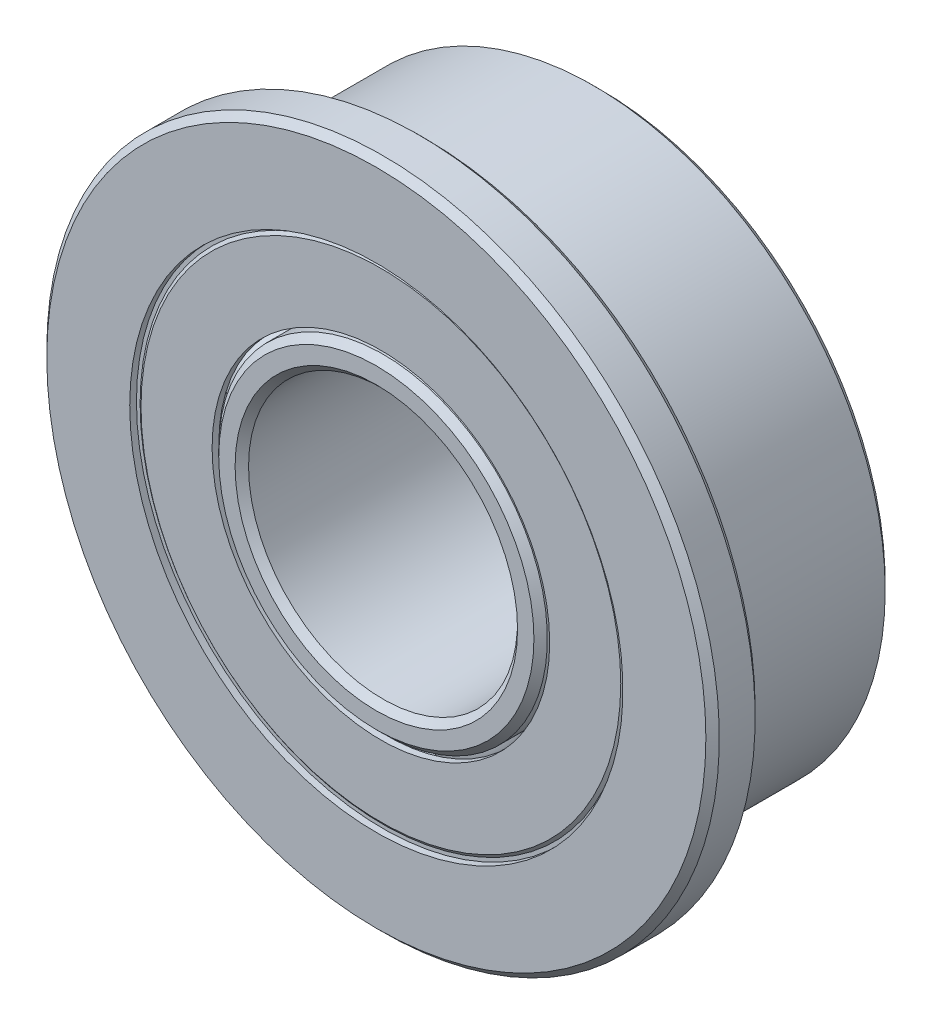
ISO-10303-21;
HEADER;
FILE_DESCRIPTION(('STEP AP214'),'2;1');
FILE_NAME('part.step','',(''),(''),'','','');
FILE_SCHEMA(('AUTOMOTIVE_DESIGN { 1 0 10303 214 1 1 1 1 }'));
ENDSEC;
DATA;
#1=APPLICATION_CONTEXT('core data for automotive mechanical design processes');
#2=APPLICATION_PROTOCOL_DEFINITION('international standard','automotive_design',2000,#1);
#3=PRODUCT_CONTEXT('',#1,'mechanical');
#4=PRODUCT('Part','Part','',(#3));
#5=PRODUCT_RELATED_PRODUCT_CATEGORY('part','',(#4));
#6=PRODUCT_DEFINITION_FORMATION('','',#4);
#7=PRODUCT_DEFINITION_CONTEXT('part definition',#1,'design');
#8=PRODUCT_DEFINITION('design','',#6,#7);
#9=PRODUCT_DEFINITION_SHAPE('','',#8);
#10=(LENGTH_UNIT() NAMED_UNIT(*) SI_UNIT(.MILLI.,.METRE.));
#11=(NAMED_UNIT(*) PLANE_ANGLE_UNIT() SI_UNIT($,.RADIAN.));
#12=(NAMED_UNIT(*) SI_UNIT($,.STERADIAN.) SOLID_ANGLE_UNIT());
#13=UNCERTAINTY_MEASURE_WITH_UNIT(LENGTH_MEASURE(1.E-05),#10,'distance_accuracy_value','');
#14=(GEOMETRIC_REPRESENTATION_CONTEXT(3) GLOBAL_UNCERTAINTY_ASSIGNED_CONTEXT((#13)) GLOBAL_UNIT_ASSIGNED_CONTEXT((#10,
#11,#12)) REPRESENTATION_CONTEXT('',''));
#15=CARTESIAN_POINT('',(0.,0.,0.));
#16=DIRECTION('',(0.,0.,1.));
#17=DIRECTION('',(1.,0.,0.));
#18=AXIS2_PLACEMENT_3D('',#15,#16,#17);
#19=CARTESIAN_POINT('',(0.,4.5825,0.));
#20=DIRECTION('',(0.,0.,1.));
#21=DIRECTION('',(0.,1.,0.));
#22=AXIS2_PLACEMENT_3D('',#19,#20,#21);
#23=SPHERICAL_SURFACE('',#22,1.);
#24=CARTESIAN_POINT('',(0.,4.5825,1.));
#25=VERTEX_POINT('',#24);
#26=VERTEX_LOOP('',#25);
#27=FACE_BOUND('',#26,.T.);
#28=ADVANCED_FACE('P0_F13',(#27),#23,.T.);
#29=CLOSED_SHELL('',(#28));
#30=MANIFOLD_SOLID_BREP('P0_B1',#29);
#31=CARTESIAN_POINT('',(3.24031682478736,3.24031682478735,0.));
#32=DIRECTION('',(0.,0.,1.));
#33=DIRECTION('',(0.707106781186549,0.707106781186546,0.));
#34=AXIS2_PLACEMENT_3D('',#31,#32,#33);
#35=SPHERICAL_SURFACE('',#34,1.);
#36=CARTESIAN_POINT('',(3.24031682478736,3.24031682478735,1.));
#37=VERTEX_POINT('',#36);
#38=VERTEX_LOOP('',#37);
#39=FACE_BOUND('',#38,.T.);
#40=ADVANCED_FACE('P1_F13',(#39),#35,.T.);
#41=CLOSED_SHELL('',(#40));
#42=MANIFOLD_SOLID_BREP('P1_B1',#41);
#43=CARTESIAN_POINT('',(4.5825,0.,0.));
#44=DIRECTION('',(0.,0.,1.));
#45=DIRECTION('',(1.,0.,0.));
#46=AXIS2_PLACEMENT_3D('',#43,#44,#45);
#47=SPHERICAL_SURFACE('',#46,1.);
#48=CARTESIAN_POINT('',(4.5825,0.,1.));
#49=VERTEX_POINT('',#48);
#50=VERTEX_LOOP('',#49);
#51=FACE_BOUND('',#50,.T.);
#52=ADVANCED_FACE('P2_F13',(#51),#47,.T.);
#53=CLOSED_SHELL('',(#52));
#54=MANIFOLD_SOLID_BREP('P2_B1',#53);
#55=CARTESIAN_POINT('',(3.24031682478733,-3.24031682478737,0.));
#56=DIRECTION('',(0.,0.,1.));
#57=DIRECTION('',(0.707106781186544,-0.707106781186551,0.));
#58=AXIS2_PLACEMENT_3D('',#55,#56,#57);
#59=SPHERICAL_SURFACE('',#58,1.);
#60=CARTESIAN_POINT('',(3.24031682478733,-3.24031682478737,1.));
#61=VERTEX_POINT('',#60);
#62=VERTEX_LOOP('',#61);
#63=FACE_BOUND('',#62,.T.);
#64=ADVANCED_FACE('P3_F13',(#63),#59,.T.);
#65=CLOSED_SHELL('',(#64));
#66=MANIFOLD_SOLID_BREP('P3_B1',#65);
#67=CARTESIAN_POINT('',(0.,-4.5825,0.));
#68=DIRECTION('',(0.,0.,1.));
#69=DIRECTION('',(0.,-1.,0.));
#70=AXIS2_PLACEMENT_3D('',#67,#68,#69);
#71=SPHERICAL_SURFACE('',#70,1.);
#72=CARTESIAN_POINT('',(0.,-4.5825,1.));
#73=VERTEX_POINT('',#72);
#74=VERTEX_LOOP('',#73);
#75=FACE_BOUND('',#74,.T.);
#76=ADVANCED_FACE('P4_F13',(#75),#71,.T.);
#77=CLOSED_SHELL('',(#76));
#78=MANIFOLD_SOLID_BREP('P4_B1',#77);
#79=CARTESIAN_POINT('',(0.,5.5,-2.35));
#80=DIRECTION('',(0.,0.,-1.));
#81=DIRECTION('',(-1.,0.,0.));
#82=AXIS2_PLACEMENT_3D('',#79,#80,#81);
#83=PLANE('',#82);
#84=CARTESIAN_POINT('',(0.,0.,-2.35));
#85=DIRECTION('',(0.,0.,-1.));
#86=DIRECTION('',(-1.,0.,0.));
#87=AXIS2_PLACEMENT_3D('',#84,#85,#86);
#88=CIRCLE('',#87,5.5);
#89=CARTESIAN_POINT('',(-5.5,0.,-2.35));
#90=VERTEX_POINT('',#89);
#91=EDGE_CURVE('P5_E43',#90,#90,#88,.T.);
#92=ORIENTED_EDGE('',*,*,#91,.T.);
#93=EDGE_LOOP('',(#92));
#94=FACE_BOUND('',#93,.T.);
#95=CARTESIAN_POINT('',(0.,0.,-2.35));
#96=DIRECTION('',(0.,0.,-1.));
#97=DIRECTION('',(-1.,0.,0.));
#98=AXIS2_PLACEMENT_3D('',#95,#96,#97);
#99=CIRCLE('',#98,5.41874355173163);
#100=CARTESIAN_POINT('',(-5.41874355173163,0.,-2.35));
#101=VERTEX_POINT('',#100);
#102=EDGE_CURVE('P5_E10',#101,#101,#99,.T.);
#103=ORIENTED_EDGE('',*,*,#102,.F.);
#104=EDGE_LOOP('',(#103));
#105=FACE_BOUND('',#104,.T.);
#106=ADVANCED_FACE('P5_F15',(#94,#105),#83,.T.);
#107=CARTESIAN_POINT('',(0.,0.,-2.3981347531258));
#108=DIRECTION('',(0.,0.,1.));
#109=DIRECTION('',(1.,0.,0.));
#110=AXIS2_PLACEMENT_3D('',#107,#108,#109);
#111=CONICAL_SURFACE('',#110,5.35,0.959931088596879);
#112=ORIENTED_EDGE('',*,*,#102,.T.);
#113=EDGE_LOOP('',(#112));
#114=FACE_BOUND('',#113,.T.);
#115=CARTESIAN_POINT('',(0.,0.,-2.3981347531258));
#116=DIRECTION('',(0.,0.,-1.));
#117=DIRECTION('',(-1.,0.,0.));
#118=AXIS2_PLACEMENT_3D('',#115,#116,#117);
#119=CIRCLE('',#118,5.35);
#120=CARTESIAN_POINT('',(-5.35,0.,-2.3981347531258));
#121=VERTEX_POINT('',#120);
#122=EDGE_CURVE('P5_E21',#121,#121,#119,.T.);
#123=ORIENTED_EDGE('',*,*,#122,.F.);
#124=EDGE_LOOP('',(#123));
#125=FACE_BOUND('',#124,.T.);
#126=ADVANCED_FACE('P5_F63',(#114,#125),#111,.T.);
#127=CARTESIAN_POINT('',(0.,5.35,-2.3981347531258));
#128=DIRECTION('',(0.,0.,-1.));
#129=DIRECTION('',(-1.,0.,0.));
#130=AXIS2_PLACEMENT_3D('',#127,#128,#129);
#131=PLANE('',#130);
#132=ORIENTED_EDGE('',*,*,#122,.T.);
#133=EDGE_LOOP('',(#132));
#134=FACE_BOUND('',#133,.T.);
#135=CARTESIAN_POINT('',(0.,0.,-2.3981347531258));
#136=DIRECTION('',(0.,0.,-1.));
#137=DIRECTION('',(-1.,0.,0.));
#138=AXIS2_PLACEMENT_3D('',#135,#136,#137);
#139=CIRCLE('',#138,3.765);
#140=CARTESIAN_POINT('',(-3.765,0.,-2.3981347531258));
#141=VERTEX_POINT('',#140);
#142=EDGE_CURVE('P5_E25',#141,#141,#139,.T.);
#143=ORIENTED_EDGE('',*,*,#142,.F.);
#144=EDGE_LOOP('',(#143));
#145=FACE_BOUND('',#144,.T.);
#146=ADVANCED_FACE('P5_F68',(#134,#145),#131,.T.);
#147=CARTESIAN_POINT('',(0.,0.,0.));
#148=DIRECTION('',(0.,0.,-1.));
#149=DIRECTION('',(-1.,0.,0.));
#150=AXIS2_PLACEMENT_3D('',#147,#148,#149);
#151=CYLINDRICAL_SURFACE('',#150,3.765);
#152=ORIENTED_EDGE('',*,*,#142,.T.);
#153=EDGE_LOOP('',(#152));
#154=FACE_BOUND('',#153,.T.);
#155=CARTESIAN_POINT('',(0.,0.,-2.2481347531258));
#156=DIRECTION('',(0.,0.,-1.));
#157=DIRECTION('',(-1.,0.,0.));
#158=AXIS2_PLACEMENT_3D('',#155,#156,#157);
#159=CIRCLE('',#158,3.765);
#160=CARTESIAN_POINT('',(-3.765,0.,-2.2481347531258));
#161=VERTEX_POINT('',#160);
#162=EDGE_CURVE('P5_E29',#161,#161,#159,.T.);
#163=ORIENTED_EDGE('',*,*,#162,.F.);
#164=EDGE_LOOP('',(#163));
#165=FACE_BOUND('',#164,.T.);
#166=ADVANCED_FACE('P5_F73',(#154,#165),#151,.F.);
#167=CARTESIAN_POINT('',(0.,5.30270518166815,-2.2481347531258));
#168=DIRECTION('',(0.,0.,1.));
#169=DIRECTION('',(1.,0.,0.));
#170=AXIS2_PLACEMENT_3D('',#167,#168,#169);
#171=PLANE('',#170);
#172=ORIENTED_EDGE('',*,*,#162,.T.);
#173=EDGE_LOOP('',(#172));
#174=FACE_BOUND('',#173,.T.);
#175=CARTESIAN_POINT('',(0.,0.,-2.2481347531258));
#176=DIRECTION('',(0.,0.,-1.));
#177=DIRECTION('',(-1.,0.,0.));
#178=AXIS2_PLACEMENT_3D('',#175,#176,#177);
#179=CIRCLE('',#178,5.30270518166815);
#180=CARTESIAN_POINT('',(-5.30270518166815,0.,-2.2481347531258));
#181=VERTEX_POINT('',#180);
#182=EDGE_CURVE('P5_E34',#181,#181,#179,.T.);
#183=ORIENTED_EDGE('',*,*,#182,.F.);
#184=EDGE_LOOP('',(#183));
#185=FACE_BOUND('',#184,.T.);
#186=ADVANCED_FACE('P5_F79',(#174,#185),#171,.T.);
#187=CARTESIAN_POINT('',(0.,0.,-2.21501856481159));
#188=DIRECTION('',(0.,0.,1.));
#189=DIRECTION('',(1.,0.,0.));
#190=AXIS2_PLACEMENT_3D('',#187,#188,#189);
#191=CONICAL_SURFACE('',#190,5.35,0.959931088596885);
#192=ORIENTED_EDGE('',*,*,#182,.T.);
#193=EDGE_LOOP('',(#192));
#194=FACE_BOUND('',#193,.T.);
#195=CARTESIAN_POINT('',(0.,0.,-2.21501856481159));
#196=DIRECTION('',(0.,0.,-1.));
#197=DIRECTION('',(-1.,0.,0.));
#198=AXIS2_PLACEMENT_3D('',#195,#196,#197);
#199=CIRCLE('',#198,5.35);
#200=CARTESIAN_POINT('',(-5.35,0.,-2.21501856481159));
#201=VERTEX_POINT('',#200);
#202=EDGE_CURVE('P5_E37',#201,#201,#199,.T.);
#203=ORIENTED_EDGE('',*,*,#202,.F.);
#204=EDGE_LOOP('',(#203));
#205=FACE_BOUND('',#204,.T.);
#206=ADVANCED_FACE('P5_F59',(#194,#205),#191,.F.);
#207=CARTESIAN_POINT('',(0.,5.35,-2.21501856481158));
#208=DIRECTION('',(0.,0.,1.));
#209=DIRECTION('',(1.,0.,0.));
#210=AXIS2_PLACEMENT_3D('',#207,#208,#209);
#211=PLANE('',#210);
#212=ORIENTED_EDGE('',*,*,#202,.T.);
#213=EDGE_LOOP('',(#212));
#214=FACE_BOUND('',#213,.T.);
#215=CARTESIAN_POINT('',(0.,0.,-2.21501856481158));
#216=DIRECTION('',(0.,0.,-1.));
#217=DIRECTION('',(-1.,0.,0.));
#218=AXIS2_PLACEMENT_3D('',#215,#216,#217);
#219=CIRCLE('',#218,5.5);
#220=CARTESIAN_POINT('',(-5.5,0.,-2.21501856481158));
#221=VERTEX_POINT('',#220);
#222=EDGE_CURVE('P5_E40',#221,#221,#219,.T.);
#223=ORIENTED_EDGE('',*,*,#222,.F.);
#224=EDGE_LOOP('',(#223));
#225=FACE_BOUND('',#224,.T.);
#226=ADVANCED_FACE('P5_F51',(#214,#225),#211,.T.);
#227=CARTESIAN_POINT('',(0.,0.,0.));
#228=DIRECTION('',(0.,0.,-1.));
#229=DIRECTION('',(-1.,0.,0.));
#230=AXIS2_PLACEMENT_3D('',#227,#228,#229);
#231=CYLINDRICAL_SURFACE('',#230,5.5);
#232=ORIENTED_EDGE('',*,*,#222,.T.);
#233=EDGE_LOOP('',(#232));
#234=FACE_BOUND('',#233,.T.);
#235=ORIENTED_EDGE('',*,*,#91,.F.);
#236=EDGE_LOOP('',(#235));
#237=FACE_BOUND('',#236,.T.);
#238=ADVANCED_FACE('P5_F49',(#234,#237),#231,.T.);
#239=CLOSED_SHELL('',(#106,#126,#146,#166,#186,#206,#226,#238));
#240=MANIFOLD_SOLID_BREP('P5_B1',#239);
#241=CARTESIAN_POINT('',(-3.24031682478738,-3.24031682478732,0.));
#242=DIRECTION('',(0.,0.,1.));
#243=DIRECTION('',(-0.707106781186554,-0.707106781186541,0.));
#244=AXIS2_PLACEMENT_3D('',#241,#242,#243);
#245=SPHERICAL_SURFACE('',#244,1.);
#246=CARTESIAN_POINT('',(-3.24031682478738,-3.24031682478732,1.));
#247=VERTEX_POINT('',#246);
#248=VERTEX_LOOP('',#247);
#249=FACE_BOUND('',#248,.T.);
#250=ADVANCED_FACE('P6_F13',(#249),#245,.T.);
#251=CLOSED_SHELL('',(#250));
#252=MANIFOLD_SOLID_BREP('P6_B1',#251);
#253=CARTESIAN_POINT('',(0.,0.,0.));
#254=DIRECTION('',(0.,0.,-1.));
#255=DIRECTION('',(-1.,0.,0.));
#256=AXIS2_PLACEMENT_3D('',#253,#254,#255);
#257=TOROIDAL_SURFACE('',#256,4.5825,0.92698521097883);
#258=CARTESIAN_POINT('',(0.,0.,-0.132269918626519));
#259=DIRECTION('',(0.,0.,-1.));
#260=DIRECTION('',(-1.,0.,0.));
#261=AXIS2_PLACEMENT_3D('',#258,#259,#260);
#262=CIRCLE('',#261,5.5);
#263=CARTESIAN_POINT('',(-5.5,0.,-0.132269918626519));
#264=VERTEX_POINT('',#263);
#265=EDGE_CURVE('P7_E18',#264,#264,#262,.T.);
#266=ORIENTED_EDGE('',*,*,#265,.T.);
#267=EDGE_LOOP('',(#266));
#268=FACE_BOUND('',#267,.T.);
#269=CARTESIAN_POINT('',(0.,0.,0.132269918626519));
#270=DIRECTION('',(0.,0.,-1.));
#271=DIRECTION('',(-1.,0.,0.));
#272=AXIS2_PLACEMENT_3D('',#269,#270,#271);
#273=CIRCLE('',#272,5.5);
#274=CARTESIAN_POINT('',(-5.5,0.,0.132269918626519));
#275=VERTEX_POINT('',#274);
#276=EDGE_CURVE('P7_E31',#275,#275,#273,.T.);
#277=ORIENTED_EDGE('',*,*,#276,.F.);
#278=EDGE_LOOP('',(#277));
#279=FACE_BOUND('',#278,.T.);
#280=ADVANCED_FACE('P7_F15',(#268,#279),#257,.F.);
#281=CARTESIAN_POINT('',(0.,0.,0.));
#282=DIRECTION('',(0.,0.,-1.));
#283=DIRECTION('',(-1.,0.,0.));
#284=AXIS2_PLACEMENT_3D('',#281,#282,#283);
#285=CYLINDRICAL_SURFACE('',#284,5.5);
#286=CARTESIAN_POINT('',(0.,0.,-2.35));
#287=DIRECTION('',(0.,0.,-1.));
#288=DIRECTION('',(-1.,0.,0.));
#289=AXIS2_PLACEMENT_3D('',#286,#287,#288);
#290=CIRCLE('',#289,5.5);
#291=CARTESIAN_POINT('',(-5.5,0.,-2.35));
#292=VERTEX_POINT('',#291);
#293=EDGE_CURVE('P7_E26',#292,#292,#290,.T.);
#294=ORIENTED_EDGE('',*,*,#293,.T.);
#295=EDGE_LOOP('',(#294));
#296=FACE_BOUND('',#295,.T.);
#297=ORIENTED_EDGE('',*,*,#265,.F.);
#298=EDGE_LOOP('',(#297));
#299=FACE_BOUND('',#298,.T.);
#300=ADVANCED_FACE('P7_F45',(#296,#299),#285,.F.);
#301=CARTESIAN_POINT('',(0.,0.,-2.35));
#302=DIRECTION('',(0.,0.,-1.));
#303=DIRECTION('',(-1.,0.,0.));
#304=AXIS2_PLACEMENT_3D('',#301,#302,#303);
#305=CONICAL_SURFACE('',#304,5.5,0.785398163397451);
#306=CARTESIAN_POINT('',(0.,0.,-2.5));
#307=DIRECTION('',(0.,0.,-1.));
#308=DIRECTION('',(-1.,0.,0.));
#309=AXIS2_PLACEMENT_3D('',#306,#307,#308);
#310=CIRCLE('',#309,5.65);
#311=CARTESIAN_POINT('',(-5.65,0.,-2.5));
#312=VERTEX_POINT('',#311);
#313=EDGE_CURVE('P7_E40',#312,#312,#310,.T.);
#314=ORIENTED_EDGE('',*,*,#313,.T.);
#315=EDGE_LOOP('',(#314));
#316=FACE_BOUND('',#315,.T.);
#317=ORIENTED_EDGE('',*,*,#293,.F.);
#318=EDGE_LOOP('',(#317));
#319=FACE_BOUND('',#318,.T.);
#320=ADVANCED_FACE('P7_F48',(#316,#319),#305,.F.);
#321=CARTESIAN_POINT('',(0.,5.65,-2.5));
#322=DIRECTION('',(0.,0.,-1.));
#323=DIRECTION('',(-1.,0.,0.));
#324=AXIS2_PLACEMENT_3D('',#321,#322,#323);
#325=PLANE('',#324);
#326=CARTESIAN_POINT('',(0.,0.,-2.5));
#327=DIRECTION('',(0.,0.,-1.));
#328=DIRECTION('',(-1.,0.,0.));
#329=AXIS2_PLACEMENT_3D('',#326,#327,#328);
#330=CIRCLE('',#329,6.35);
#331=CARTESIAN_POINT('',(-6.35,0.,-2.5));
#332=VERTEX_POINT('',#331);
#333=EDGE_CURVE('P7_E37',#332,#332,#330,.T.);
#334=ORIENTED_EDGE('',*,*,#333,.T.);
#335=EDGE_LOOP('',(#334));
#336=FACE_BOUND('',#335,.T.);
#337=ORIENTED_EDGE('',*,*,#313,.F.);
#338=EDGE_LOOP('',(#337));
#339=FACE_BOUND('',#338,.T.);
#340=ADVANCED_FACE('P7_F50',(#336,#339),#325,.T.);
#341=CARTESIAN_POINT('',(0.,0.,-2.5));
#342=DIRECTION('',(0.,0.,1.));
#343=DIRECTION('',(1.,0.,0.));
#344=AXIS2_PLACEMENT_3D('',#341,#342,#343);
#345=CONICAL_SURFACE('',#344,6.35,0.785398163397446);
#346=CARTESIAN_POINT('',(0.,0.,-2.35));
#347=DIRECTION('',(0.,0.,-1.));
#348=DIRECTION('',(-1.,0.,0.));
#349=AXIS2_PLACEMENT_3D('',#346,#347,#348);
#350=CIRCLE('',#349,6.5);
#351=CARTESIAN_POINT('',(-6.5,0.,-2.35));
#352=VERTEX_POINT('',#351);
#353=EDGE_CURVE('P7_E34',#352,#352,#350,.T.);
#354=ORIENTED_EDGE('',*,*,#353,.T.);
#355=EDGE_LOOP('',(#354));
#356=FACE_BOUND('',#355,.T.);
#357=ORIENTED_EDGE('',*,*,#333,.F.);
#358=EDGE_LOOP('',(#357));
#359=FACE_BOUND('',#358,.T.);
#360=ADVANCED_FACE('P7_F59',(#356,#359),#345,.T.);
#361=CARTESIAN_POINT('',(0.,0.,0.));
#362=DIRECTION('',(0.,0.,-1.));
#363=DIRECTION('',(-1.,0.,0.));
#364=AXIS2_PLACEMENT_3D('',#361,#362,#363);
#365=CYLINDRICAL_SURFACE('',#364,6.5);
#366=CARTESIAN_POINT('',(0.,0.,1.4));
#367=DIRECTION('',(0.,0.,-1.));
#368=DIRECTION('',(-1.,0.,0.));
#369=AXIS2_PLACEMENT_3D('',#366,#367,#368);
#370=CIRCLE('',#369,6.5);
#371=CARTESIAN_POINT('',(-6.5,0.,1.4));
#372=VERTEX_POINT('',#371);
#373=EDGE_CURVE('P7_E10',#372,#372,#370,.F.);
#374=ORIENTED_EDGE('',*,*,#373,.F.);
#375=EDGE_LOOP('',(#374));
#376=FACE_BOUND('',#375,.T.);
#377=ORIENTED_EDGE('',*,*,#353,.F.);
#378=EDGE_LOOP('',(#377));
#379=FACE_BOUND('',#378,.T.);
#380=ADVANCED_FACE('P7_F75',(#376,#379),#365,.T.);
#381=CARTESIAN_POINT('',(0.,0.,0.));
#382=DIRECTION('',(0.,0.,-1.));
#383=DIRECTION('',(-1.,0.,0.));
#384=AXIS2_PLACEMENT_3D('',#381,#382,#383);
#385=CYLINDRICAL_SURFACE('',#384,5.5);
#386=ORIENTED_EDGE('',*,*,#276,.T.);
#387=EDGE_LOOP('',(#386));
#388=FACE_BOUND('',#387,.T.);
#389=CARTESIAN_POINT('',(0.,0.,2.5));
#390=DIRECTION('',(0.,0.,-1.));
#391=DIRECTION('',(-1.,0.,0.));
#392=AXIS2_PLACEMENT_3D('',#389,#390,#391);
#393=CIRCLE('',#392,5.5);
#394=CARTESIAN_POINT('',(-5.5,0.,2.5));
#395=VERTEX_POINT('',#394);
#396=EDGE_CURVE('P7_E29',#395,#395,#393,.T.);
#397=ORIENTED_EDGE('',*,*,#396,.F.);
#398=EDGE_LOOP('',(#397));
#399=FACE_BOUND('',#398,.T.);
#400=ADVANCED_FACE('P7_F71',(#388,#399),#385,.F.);
#401=CARTESIAN_POINT('',(0.,0.,2.35));
#402=DIRECTION('',(0.,0.,-1.));
#403=DIRECTION('',(-1.,0.,0.));
#404=AXIS2_PLACEMENT_3D('',#401,#402,#403);
#405=CONICAL_SURFACE('',#404,7.5,0.785398163397451);
#406=CARTESIAN_POINT('',(0.,0.,2.5));
#407=DIRECTION('',(0.,0.,-1.));
#408=DIRECTION('',(-1.,0.,0.));
#409=AXIS2_PLACEMENT_3D('',#406,#407,#408);
#410=CIRCLE('',#409,7.35);
#411=CARTESIAN_POINT('',(-7.35,0.,2.5));
#412=VERTEX_POINT('',#411);
#413=EDGE_CURVE('P7_E80',#412,#412,#410,.T.);
#414=ORIENTED_EDGE('',*,*,#413,.T.);
#415=EDGE_LOOP('',(#414));
#416=FACE_BOUND('',#415,.T.);
#417=CARTESIAN_POINT('',(0.,0.,2.35));
#418=DIRECTION('',(0.,0.,-1.));
#419=DIRECTION('',(-1.,0.,0.));
#420=AXIS2_PLACEMENT_3D('',#417,#418,#419);
#421=CIRCLE('',#420,7.5);
#422=CARTESIAN_POINT('',(-7.5,0.,2.35));
#423=VERTEX_POINT('',#422);
#424=EDGE_CURVE('P7_E82',#423,#423,#421,.T.);
#425=ORIENTED_EDGE('',*,*,#424,.F.);
#426=EDGE_LOOP('',(#425));
#427=FACE_BOUND('',#426,.T.);
#428=ADVANCED_FACE('P7_F74',(#416,#427),#405,.T.);
#429=CARTESIAN_POINT('',(0.,0.,0.));
#430=DIRECTION('',(0.,0.,-1.));
#431=DIRECTION('',(-1.,0.,0.));
#432=AXIS2_PLACEMENT_3D('',#429,#430,#431);
#433=CYLINDRICAL_SURFACE('',#432,7.5);
#434=ORIENTED_EDGE('',*,*,#424,.T.);
#435=EDGE_LOOP('',(#434));
#436=FACE_BOUND('',#435,.T.);
#437=CARTESIAN_POINT('',(0.,0.,1.55));
#438=DIRECTION('',(0.,0.,-1.));
#439=DIRECTION('',(-1.,0.,0.));
#440=AXIS2_PLACEMENT_3D('',#437,#438,#439);
#441=CIRCLE('',#440,7.5);
#442=CARTESIAN_POINT('',(-7.5,0.,1.55));
#443=VERTEX_POINT('',#442);
#444=EDGE_CURVE('P7_E86',#443,#443,#441,.T.);
#445=ORIENTED_EDGE('',*,*,#444,.F.);
#446=EDGE_LOOP('',(#445));
#447=FACE_BOUND('',#446,.T.);
#448=ADVANCED_FACE('P7_F99',(#436,#447),#433,.T.);
#449=CARTESIAN_POINT('',(0.,0.,1.4));
#450=DIRECTION('',(0.,0.,1.));
#451=DIRECTION('',(1.,0.,0.));
#452=AXIS2_PLACEMENT_3D('',#449,#450,#451);
#453=CONICAL_SURFACE('',#452,7.35,0.785398163397454);
#454=ORIENTED_EDGE('',*,*,#444,.T.);
#455=EDGE_LOOP('',(#454));
#456=FACE_BOUND('',#455,.T.);
#457=CARTESIAN_POINT('',(0.,0.,1.4));
#458=DIRECTION('',(0.,0.,-1.));
#459=DIRECTION('',(-1.,0.,0.));
#460=AXIS2_PLACEMENT_3D('',#457,#458,#459);
#461=CIRCLE('',#460,7.35);
#462=CARTESIAN_POINT('',(-7.35,0.,1.4));
#463=VERTEX_POINT('',#462);
#464=EDGE_CURVE('P7_E91',#463,#463,#461,.T.);
#465=ORIENTED_EDGE('',*,*,#464,.F.);
#466=EDGE_LOOP('',(#465));
#467=FACE_BOUND('',#466,.T.);
#468=ADVANCED_FACE('P7_F97',(#456,#467),#453,.T.);
#469=CARTESIAN_POINT('',(0.,7.35,1.4));
#470=DIRECTION('',(0.,0.,-1.));
#471=DIRECTION('',(-1.,0.,0.));
#472=AXIS2_PLACEMENT_3D('',#469,#470,#471);
#473=PLANE('',#472);
#474=ORIENTED_EDGE('',*,*,#373,.T.);
#475=EDGE_LOOP('',(#474));
#476=FACE_BOUND('',#475,.T.);
#477=ORIENTED_EDGE('',*,*,#464,.T.);
#478=EDGE_LOOP('',(#477));
#479=FACE_BOUND('',#478,.T.);
#480=ADVANCED_FACE('P7_F95',(#476,#479),#473,.T.);
#481=CARTESIAN_POINT('',(0.,6.35,2.5));
#482=DIRECTION('',(0.,0.,1.));
#483=DIRECTION('',(1.,0.,0.));
#484=AXIS2_PLACEMENT_3D('',#481,#482,#483);
#485=PLANE('',#484);
#486=ORIENTED_EDGE('',*,*,#396,.T.);
#487=EDGE_LOOP('',(#486));
#488=FACE_BOUND('',#487,.T.);
#489=ORIENTED_EDGE('',*,*,#413,.F.);
#490=EDGE_LOOP('',(#489));
#491=FACE_BOUND('',#490,.T.);
#492=ADVANCED_FACE('P7_F107',(#488,#491),#485,.T.);
#493=CLOSED_SHELL('',(#280,#300,#320,#340,#360,#380,#400,#428,#448,#468,#480,#492));
#494=MANIFOLD_SOLID_BREP('P7_B1',#493);
#495=CARTESIAN_POINT('',(-4.5825,0.,0.));
#496=DIRECTION('',(0.,0.,1.));
#497=DIRECTION('',(-1.,0.,0.));
#498=AXIS2_PLACEMENT_3D('',#495,#496,#497);
#499=SPHERICAL_SURFACE('',#498,1.);
#500=CARTESIAN_POINT('',(-4.5825,0.,1.));
#501=VERTEX_POINT('',#500);
#502=VERTEX_LOOP('',#501);
#503=FACE_BOUND('',#502,.T.);
#504=ADVANCED_FACE('P8_F13',(#503),#499,.T.);
#505=CLOSED_SHELL('',(#504));
#506=MANIFOLD_SOLID_BREP('P8_B1',#505);
#507=CARTESIAN_POINT('',(0.,5.35,2.21501856481158));
#508=DIRECTION('',(0.,0.,-1.));
#509=DIRECTION('',(-1.,0.,0.));
#510=AXIS2_PLACEMENT_3D('',#507,#508,#509);
#511=PLANE('',#510);
#512=CARTESIAN_POINT('',(0.,0.,2.21501856481158));
#513=DIRECTION('',(0.,0.,-1.));
#514=DIRECTION('',(-1.,0.,0.));
#515=AXIS2_PLACEMENT_3D('',#512,#513,#514);
#516=CIRCLE('',#515,5.5);
#517=CARTESIAN_POINT('',(-5.5,0.,2.21501856481158));
#518=VERTEX_POINT('',#517);
#519=EDGE_CURVE('P9_E43',#518,#518,#516,.T.);
#520=ORIENTED_EDGE('',*,*,#519,.T.);
#521=EDGE_LOOP('',(#520));
#522=FACE_BOUND('',#521,.T.);
#523=CARTESIAN_POINT('',(0.,0.,2.21501856481159));
#524=DIRECTION('',(0.,0.,-1.));
#525=DIRECTION('',(-1.,0.,0.));
#526=AXIS2_PLACEMENT_3D('',#523,#524,#525);
#527=CIRCLE('',#526,5.35);
#528=CARTESIAN_POINT('',(-5.35,0.,2.21501856481159));
#529=VERTEX_POINT('',#528);
#530=EDGE_CURVE('P9_E10',#529,#529,#527,.T.);
#531=ORIENTED_EDGE('',*,*,#530,.F.);
#532=EDGE_LOOP('',(#531));
#533=FACE_BOUND('',#532,.T.);
#534=ADVANCED_FACE('P9_F15',(#522,#533),#511,.T.);
#535=CARTESIAN_POINT('',(0.,0.,2.2481347531258));
#536=DIRECTION('',(0.,0.,-1.));
#537=DIRECTION('',(-1.,0.,0.));
#538=AXIS2_PLACEMENT_3D('',#535,#536,#537);
#539=CONICAL_SURFACE('',#538,5.30270518166815,0.959931088596885);
#540=ORIENTED_EDGE('',*,*,#530,.T.);
#541=EDGE_LOOP('',(#540));
#542=FACE_BOUND('',#541,.T.);
#543=CARTESIAN_POINT('',(0.,0.,2.2481347531258));
#544=DIRECTION('',(0.,0.,-1.));
#545=DIRECTION('',(-1.,0.,0.));
#546=AXIS2_PLACEMENT_3D('',#543,#544,#545);
#547=CIRCLE('',#546,5.30270518166815);
#548=CARTESIAN_POINT('',(-5.30270518166815,0.,2.2481347531258));
#549=VERTEX_POINT('',#548);
#550=EDGE_CURVE('P9_E21',#549,#549,#547,.T.);
#551=ORIENTED_EDGE('',*,*,#550,.F.);
#552=EDGE_LOOP('',(#551));
#553=FACE_BOUND('',#552,.T.);
#554=ADVANCED_FACE('P9_F63',(#542,#553),#539,.F.);
#555=CARTESIAN_POINT('',(0.,5.30270518166815,2.2481347531258));
#556=DIRECTION('',(0.,0.,-1.));
#557=DIRECTION('',(-1.,0.,0.));
#558=AXIS2_PLACEMENT_3D('',#555,#556,#557);
#559=PLANE('',#558);
#560=ORIENTED_EDGE('',*,*,#550,.T.);
#561=EDGE_LOOP('',(#560));
#562=FACE_BOUND('',#561,.T.);
#563=CARTESIAN_POINT('',(0.,0.,2.2481347531258));
#564=DIRECTION('',(0.,0.,-1.));
#565=DIRECTION('',(-1.,0.,0.));
#566=AXIS2_PLACEMENT_3D('',#563,#564,#565);
#567=CIRCLE('',#566,3.765);
#568=CARTESIAN_POINT('',(-3.765,0.,2.2481347531258));
#569=VERTEX_POINT('',#568);
#570=EDGE_CURVE('P9_E25',#569,#569,#567,.T.);
#571=ORIENTED_EDGE('',*,*,#570,.F.);
#572=EDGE_LOOP('',(#571));
#573=FACE_BOUND('',#572,.T.);
#574=ADVANCED_FACE('P9_F68',(#562,#573),#559,.T.);
#575=CARTESIAN_POINT('',(0.,0.,0.));
#576=DIRECTION('',(0.,0.,-1.));
#577=DIRECTION('',(-1.,0.,0.));
#578=AXIS2_PLACEMENT_3D('',#575,#576,#577);
#579=CYLINDRICAL_SURFACE('',#578,3.765);
#580=ORIENTED_EDGE('',*,*,#570,.T.);
#581=EDGE_LOOP('',(#580));
#582=FACE_BOUND('',#581,.T.);
#583=CARTESIAN_POINT('',(0.,0.,2.3981347531258));
#584=DIRECTION('',(0.,0.,-1.));
#585=DIRECTION('',(-1.,0.,0.));
#586=AXIS2_PLACEMENT_3D('',#583,#584,#585);
#587=CIRCLE('',#586,3.765);
#588=CARTESIAN_POINT('',(-3.765,0.,2.3981347531258));
#589=VERTEX_POINT('',#588);
#590=EDGE_CURVE('P9_E29',#589,#589,#587,.T.);
#591=ORIENTED_EDGE('',*,*,#590,.F.);
#592=EDGE_LOOP('',(#591));
#593=FACE_BOUND('',#592,.T.);
#594=ADVANCED_FACE('P9_F73',(#582,#593),#579,.F.);
#595=CARTESIAN_POINT('',(0.,5.35,2.3981347531258));
#596=DIRECTION('',(0.,0.,1.));
#597=DIRECTION('',(1.,0.,0.));
#598=AXIS2_PLACEMENT_3D('',#595,#596,#597);
#599=PLANE('',#598);
#600=ORIENTED_EDGE('',*,*,#590,.T.);
#601=EDGE_LOOP('',(#600));
#602=FACE_BOUND('',#601,.T.);
#603=CARTESIAN_POINT('',(0.,0.,2.3981347531258));
#604=DIRECTION('',(0.,0.,-1.));
#605=DIRECTION('',(-1.,0.,0.));
#606=AXIS2_PLACEMENT_3D('',#603,#604,#605);
#607=CIRCLE('',#606,5.35);
#608=CARTESIAN_POINT('',(-5.35,0.,2.3981347531258));
#609=VERTEX_POINT('',#608);
#610=EDGE_CURVE('P9_E34',#609,#609,#607,.T.);
#611=ORIENTED_EDGE('',*,*,#610,.F.);
#612=EDGE_LOOP('',(#611));
#613=FACE_BOUND('',#612,.T.);
#614=ADVANCED_FACE('P9_F79',(#602,#613),#599,.T.);
#615=CARTESIAN_POINT('',(0.,0.,2.35));
#616=DIRECTION('',(0.,0.,-1.));
#617=DIRECTION('',(-1.,0.,0.));
#618=AXIS2_PLACEMENT_3D('',#615,#616,#617);
#619=CONICAL_SURFACE('',#618,5.41874355173163,0.959931088596879);
#620=ORIENTED_EDGE('',*,*,#610,.T.);
#621=EDGE_LOOP('',(#620));
#622=FACE_BOUND('',#621,.T.);
#623=CARTESIAN_POINT('',(0.,0.,2.35));
#624=DIRECTION('',(0.,0.,-1.));
#625=DIRECTION('',(-1.,0.,0.));
#626=AXIS2_PLACEMENT_3D('',#623,#624,#625);
#627=CIRCLE('',#626,5.41874355173163);
#628=CARTESIAN_POINT('',(-5.41874355173163,0.,2.35));
#629=VERTEX_POINT('',#628);
#630=EDGE_CURVE('P9_E37',#629,#629,#627,.T.);
#631=ORIENTED_EDGE('',*,*,#630,.F.);
#632=EDGE_LOOP('',(#631));
#633=FACE_BOUND('',#632,.T.);
#634=ADVANCED_FACE('P9_F59',(#622,#633),#619,.T.);
#635=CARTESIAN_POINT('',(0.,5.5,2.35));
#636=DIRECTION('',(0.,0.,1.));
#637=DIRECTION('',(1.,0.,0.));
#638=AXIS2_PLACEMENT_3D('',#635,#636,#637);
#639=PLANE('',#638);
#640=ORIENTED_EDGE('',*,*,#630,.T.);
#641=EDGE_LOOP('',(#640));
#642=FACE_BOUND('',#641,.T.);
#643=CARTESIAN_POINT('',(0.,0.,2.35));
#644=DIRECTION('',(0.,0.,-1.));
#645=DIRECTION('',(-1.,0.,0.));
#646=AXIS2_PLACEMENT_3D('',#643,#644,#645);
#647=CIRCLE('',#646,5.5);
#648=CARTESIAN_POINT('',(-5.5,0.,2.35));
#649=VERTEX_POINT('',#648);
#650=EDGE_CURVE('P9_E40',#649,#649,#647,.T.);
#651=ORIENTED_EDGE('',*,*,#650,.F.);
#652=EDGE_LOOP('',(#651));
#653=FACE_BOUND('',#652,.T.);
#654=ADVANCED_FACE('P9_F51',(#642,#653),#639,.T.);
#655=CARTESIAN_POINT('',(0.,0.,0.));
#656=DIRECTION('',(0.,0.,-1.));
#657=DIRECTION('',(-1.,0.,0.));
#658=AXIS2_PLACEMENT_3D('',#655,#656,#657);
#659=CYLINDRICAL_SURFACE('',#658,5.5);
#660=ORIENTED_EDGE('',*,*,#650,.T.);
#661=EDGE_LOOP('',(#660));
#662=FACE_BOUND('',#661,.T.);
#663=ORIENTED_EDGE('',*,*,#519,.F.);
#664=EDGE_LOOP('',(#663));
#665=FACE_BOUND('',#664,.T.);
#666=ADVANCED_FACE('P9_F49',(#662,#665),#659,.T.);
#667=CLOSED_SHELL('',(#534,#554,#574,#594,#614,#634,#654,#666));
#668=MANIFOLD_SOLID_BREP('P9_B1',#667);
#669=CARTESIAN_POINT('',(-3.24031682478731,3.24031682478739,0.));
#670=DIRECTION('',(0.,0.,1.));
#671=DIRECTION('',(-0.707106781186539,0.707106781186556,0.));
#672=AXIS2_PLACEMENT_3D('',#669,#670,#671);
#673=SPHERICAL_SURFACE('',#672,1.);
#674=CARTESIAN_POINT('',(-3.24031682478731,3.24031682478739,1.));
#675=VERTEX_POINT('',#674);
#676=VERTEX_LOOP('',#675);
#677=FACE_BOUND('',#676,.T.);
#678=ADVANCED_FACE('P10_F13',(#677),#673,.T.);
#679=CLOSED_SHELL('',(#678));
#680=MANIFOLD_SOLID_BREP('P10_B1',#679);
#681=CARTESIAN_POINT('',(0.,0.,0.));
#682=DIRECTION('',(0.,0.,-1.));
#683=DIRECTION('',(-1.,0.,0.));
#684=AXIS2_PLACEMENT_3D('',#681,#682,#683);
#685=TOROIDAL_SURFACE('',#684,4.5825,0.92698521097883);
#686=CARTESIAN_POINT('',(0.,0.,0.13226991862652));
#687=DIRECTION('',(0.,0.,-1.));
#688=DIRECTION('',(-1.,0.,0.));
#689=AXIS2_PLACEMENT_3D('',#686,#687,#688);
#690=CIRCLE('',#689,3.665);
#691=CARTESIAN_POINT('',(-3.665,0.,0.13226991862652));
#692=VERTEX_POINT('',#691);
#693=EDGE_CURVE('P11_E10',#692,#692,#690,.T.);
#694=ORIENTED_EDGE('',*,*,#693,.T.);
#695=EDGE_LOOP('',(#694));
#696=FACE_BOUND('',#695,.T.);
#697=CARTESIAN_POINT('',(0.,0.,-0.13226991862652));
#698=DIRECTION('',(0.,0.,-1.));
#699=DIRECTION('',(-1.,0.,0.));
#700=AXIS2_PLACEMENT_3D('',#697,#698,#699);
#701=CIRCLE('',#700,3.665);
#702=CARTESIAN_POINT('',(-3.665,0.,-0.13226991862652));
#703=VERTEX_POINT('',#702);
#704=EDGE_CURVE('P11_E49',#703,#703,#701,.T.);
#705=ORIENTED_EDGE('',*,*,#704,.F.);
#706=EDGE_LOOP('',(#705));
#707=FACE_BOUND('',#706,.T.);
#708=ADVANCED_FACE('P11_F15',(#696,#707),#685,.F.);
#709=CARTESIAN_POINT('',(0.,0.,0.));
#710=DIRECTION('',(0.,0.,-1.));
#711=DIRECTION('',(-1.,0.,0.));
#712=AXIS2_PLACEMENT_3D('',#709,#710,#711);
#713=CYLINDRICAL_SURFACE('',#712,3.665);
#714=CARTESIAN_POINT('',(0.,0.,2.35));
#715=DIRECTION('',(0.,0.,-1.));
#716=DIRECTION('',(-1.,0.,0.));
#717=AXIS2_PLACEMENT_3D('',#714,#715,#716);
#718=CIRCLE('',#717,3.665);
#719=CARTESIAN_POINT('',(-3.665,0.,2.35));
#720=VERTEX_POINT('',#719);
#721=EDGE_CURVE('P11_E21',#720,#720,#718,.T.);
#722=ORIENTED_EDGE('',*,*,#721,.T.);
#723=EDGE_LOOP('',(#722));
#724=FACE_BOUND('',#723,.T.);
#725=ORIENTED_EDGE('',*,*,#693,.F.);
#726=EDGE_LOOP('',(#725));
#727=FACE_BOUND('',#726,.T.);
#728=ADVANCED_FACE('P11_F57',(#724,#727),#713,.T.);
#729=CARTESIAN_POINT('',(0.,0.,2.35));
#730=DIRECTION('',(0.,0.,-1.));
#731=DIRECTION('',(-1.,0.,0.));
#732=AXIS2_PLACEMENT_3D('',#729,#730,#731);
#733=CONICAL_SURFACE('',#732,3.665,0.78539816339745);
#734=CARTESIAN_POINT('',(0.,0.,2.5));
#735=DIRECTION('',(0.,0.,-1.));
#736=DIRECTION('',(-1.,0.,0.));
#737=AXIS2_PLACEMENT_3D('',#734,#735,#736);
#738=CIRCLE('',#737,3.515);
#739=CARTESIAN_POINT('',(-3.515,0.,2.5));
#740=VERTEX_POINT('',#739);
#741=EDGE_CURVE('P11_E25',#740,#740,#738,.T.);
#742=ORIENTED_EDGE('',*,*,#741,.T.);
#743=EDGE_LOOP('',(#742));
#744=FACE_BOUND('',#743,.T.);
#745=ORIENTED_EDGE('',*,*,#721,.F.);
#746=EDGE_LOOP('',(#745));
#747=FACE_BOUND('',#746,.T.);
#748=ADVANCED_FACE('P11_F63',(#744,#747),#733,.T.);
#749=CARTESIAN_POINT('',(0.,3.15,2.5));
#750=DIRECTION('',(0.,0.,1.));
#751=DIRECTION('',(1.,0.,0.));
#752=AXIS2_PLACEMENT_3D('',#749,#750,#751);
#753=PLANE('',#752);
#754=CARTESIAN_POINT('',(0.,0.,2.5));
#755=DIRECTION('',(0.,0.,-1.));
#756=DIRECTION('',(-1.,0.,0.));
#757=AXIS2_PLACEMENT_3D('',#754,#755,#756);
#758=CIRCLE('',#757,3.15);
#759=CARTESIAN_POINT('',(-3.15,0.,2.5));
#760=VERTEX_POINT('',#759);
#761=EDGE_CURVE('P11_E29',#760,#760,#758,.T.);
#762=ORIENTED_EDGE('',*,*,#761,.T.);
#763=EDGE_LOOP('',(#762));
#764=FACE_BOUND('',#763,.T.);
#765=ORIENTED_EDGE('',*,*,#741,.F.);
#766=EDGE_LOOP('',(#765));
#767=FACE_BOUND('',#766,.T.);
#768=ADVANCED_FACE('P11_F68',(#764,#767),#753,.T.);
#769=CARTESIAN_POINT('',(0.,0.,2.5));
#770=DIRECTION('',(0.,0.,1.));
#771=DIRECTION('',(1.,0.,0.));
#772=AXIS2_PLACEMENT_3D('',#769,#770,#771);
#773=CONICAL_SURFACE('',#772,3.15,0.785398163397451);
#774=CARTESIAN_POINT('',(0.,0.,2.35));
#775=DIRECTION('',(0.,0.,-1.));
#776=DIRECTION('',(-1.,0.,0.));
#777=AXIS2_PLACEMENT_3D('',#774,#775,#776);
#778=CIRCLE('',#777,3.);
#779=CARTESIAN_POINT('',(-3.,0.,2.35));
#780=VERTEX_POINT('',#779);
#781=EDGE_CURVE('P11_E34',#780,#780,#778,.T.);
#782=ORIENTED_EDGE('',*,*,#781,.T.);
#783=EDGE_LOOP('',(#782));
#784=FACE_BOUND('',#783,.T.);
#785=ORIENTED_EDGE('',*,*,#761,.F.);
#786=EDGE_LOOP('',(#785));
#787=FACE_BOUND('',#786,.T.);
#788=ADVANCED_FACE('P11_F75',(#784,#787),#773,.F.);
#789=CARTESIAN_POINT('',(0.,0.,0.));
#790=DIRECTION('',(0.,0.,-1.));
#791=DIRECTION('',(-1.,0.,0.));
#792=AXIS2_PLACEMENT_3D('',#789,#790,#791);
#793=CYLINDRICAL_SURFACE('',#792,3.);
#794=CARTESIAN_POINT('',(0.,0.,-2.35));
#795=DIRECTION('',(0.,0.,-1.));
#796=DIRECTION('',(-1.,0.,0.));
#797=AXIS2_PLACEMENT_3D('',#794,#795,#796);
#798=CIRCLE('',#797,3.);
#799=CARTESIAN_POINT('',(-3.,0.,-2.35));
#800=VERTEX_POINT('',#799);
#801=EDGE_CURVE('P11_E37',#800,#800,#798,.T.);
#802=ORIENTED_EDGE('',*,*,#801,.T.);
#803=EDGE_LOOP('',(#802));
#804=FACE_BOUND('',#803,.T.);
#805=ORIENTED_EDGE('',*,*,#781,.F.);
#806=EDGE_LOOP('',(#805));
#807=FACE_BOUND('',#806,.T.);
#808=ADVANCED_FACE('P11_F79',(#804,#807),#793,.F.);
#809=CARTESIAN_POINT('',(0.,0.,-2.35));
#810=DIRECTION('',(0.,0.,-1.));
#811=DIRECTION('',(-1.,0.,0.));
#812=AXIS2_PLACEMENT_3D('',#809,#810,#811);
#813=CONICAL_SURFACE('',#812,3.,0.785398163397448);
#814=CARTESIAN_POINT('',(0.,0.,-2.5));
#815=DIRECTION('',(0.,0.,-1.));
#816=DIRECTION('',(-1.,0.,0.));
#817=AXIS2_PLACEMENT_3D('',#814,#815,#816);
#818=CIRCLE('',#817,3.15);
#819=CARTESIAN_POINT('',(-3.15,0.,-2.5));
#820=VERTEX_POINT('',#819);
#821=EDGE_CURVE('P11_E40',#820,#820,#818,.T.);
#822=ORIENTED_EDGE('',*,*,#821,.T.);
#823=EDGE_LOOP('',(#822));
#824=FACE_BOUND('',#823,.T.);
#825=ORIENTED_EDGE('',*,*,#801,.F.);
#826=EDGE_LOOP('',(#825));
#827=FACE_BOUND('',#826,.T.);
#828=ADVANCED_FACE('P11_F83',(#824,#827),#813,.F.);
#829=CARTESIAN_POINT('',(0.,3.515,-2.5));
#830=DIRECTION('',(0.,0.,-1.));
#831=DIRECTION('',(-1.,0.,0.));
#832=AXIS2_PLACEMENT_3D('',#829,#830,#831);
#833=PLANE('',#832);
#834=CARTESIAN_POINT('',(0.,0.,-2.5));
#835=DIRECTION('',(0.,0.,-1.));
#836=DIRECTION('',(-1.,0.,0.));
#837=AXIS2_PLACEMENT_3D('',#834,#835,#836);
#838=CIRCLE('',#837,3.515);
#839=CARTESIAN_POINT('',(-3.515,0.,-2.5));
#840=VERTEX_POINT('',#839);
#841=EDGE_CURVE('P11_E43',#840,#840,#838,.T.);
#842=ORIENTED_EDGE('',*,*,#841,.T.);
#843=EDGE_LOOP('',(#842));
#844=FACE_BOUND('',#843,.T.);
#845=ORIENTED_EDGE('',*,*,#821,.F.);
#846=EDGE_LOOP('',(#845));
#847=FACE_BOUND('',#846,.T.);
#848=ADVANCED_FACE('P11_F87',(#844,#847),#833,.T.);
#849=CARTESIAN_POINT('',(0.,0.,-2.5));
#850=DIRECTION('',(0.,0.,1.));
#851=DIRECTION('',(1.,0.,0.));
#852=AXIS2_PLACEMENT_3D('',#849,#850,#851);
#853=CONICAL_SURFACE('',#852,3.515,0.78539816339745);
#854=CARTESIAN_POINT('',(0.,0.,-2.35));
#855=DIRECTION('',(0.,0.,-1.));
#856=DIRECTION('',(-1.,0.,0.));
#857=AXIS2_PLACEMENT_3D('',#854,#855,#856);
#858=CIRCLE('',#857,3.665);
#859=CARTESIAN_POINT('',(-3.665,0.,-2.35));
#860=VERTEX_POINT('',#859);
#861=EDGE_CURVE('P11_E46',#860,#860,#858,.T.);
#862=ORIENTED_EDGE('',*,*,#861,.T.);
#863=EDGE_LOOP('',(#862));
#864=FACE_BOUND('',#863,.T.);
#865=ORIENTED_EDGE('',*,*,#841,.F.);
#866=EDGE_LOOP('',(#865));
#867=FACE_BOUND('',#866,.T.);
#868=ADVANCED_FACE('P11_F91',(#864,#867),#853,.T.);
#869=CARTESIAN_POINT('',(0.,0.,0.));
#870=DIRECTION('',(0.,0.,-1.));
#871=DIRECTION('',(-1.,0.,0.));
#872=AXIS2_PLACEMENT_3D('',#869,#870,#871);
#873=CYLINDRICAL_SURFACE('',#872,3.665);
#874=ORIENTED_EDGE('',*,*,#704,.T.);
#875=EDGE_LOOP('',(#874));
#876=FACE_BOUND('',#875,.T.);
#877=ORIENTED_EDGE('',*,*,#861,.F.);
#878=EDGE_LOOP('',(#877));
#879=FACE_BOUND('',#878,.T.);
#880=ADVANCED_FACE('P11_F53',(#876,#879),#873,.T.);
#881=CLOSED_SHELL('',(#708,#728,#748,#768,#788,#808,#828,#848,#868,#880));
#882=MANIFOLD_SOLID_BREP('P11_B1',#881);
#883=ADVANCED_BREP_SHAPE_REPRESENTATION('',(#18,#30,#42,#54,#66,#78,#240,#252,#494,#506,#668,
#680,#882),#14);
#884=SHAPE_DEFINITION_REPRESENTATION(#9,#883);
ENDSEC;
END-ISO-10303-21;
